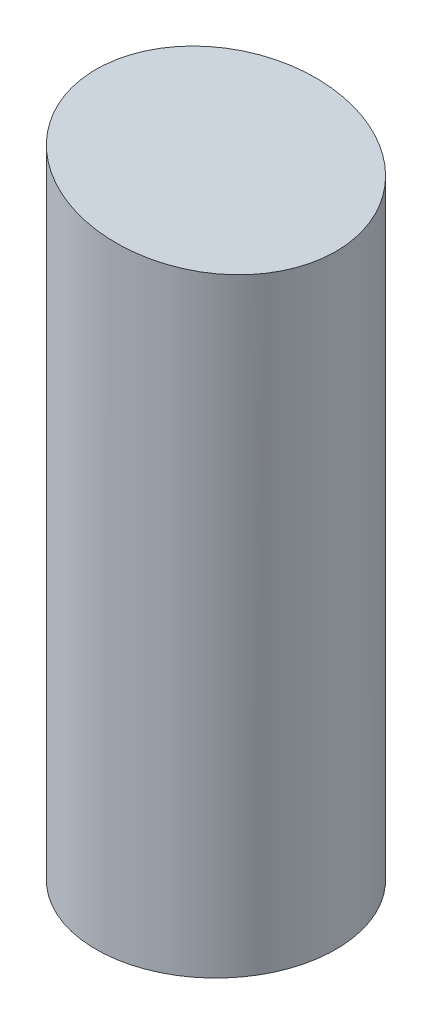
ISO-10303-21;
HEADER;
FILE_DESCRIPTION(('STEP AP214'),'2;1');
FILE_NAME('part.step','',(''),(''),'','','');
FILE_SCHEMA(('AUTOMOTIVE_DESIGN { 1 0 10303 214 1 1 1 1 }'));
ENDSEC;
DATA;
#1=APPLICATION_CONTEXT('core data for automotive mechanical design processes');
#2=APPLICATION_PROTOCOL_DEFINITION('international standard','automotive_design',2000,#1);
#3=PRODUCT_CONTEXT('',#1,'mechanical');
#4=PRODUCT('Part','Part','',(#3));
#5=PRODUCT_RELATED_PRODUCT_CATEGORY('part','',(#4));
#6=PRODUCT_DEFINITION_FORMATION('','',#4);
#7=PRODUCT_DEFINITION_CONTEXT('part definition',#1,'design');
#8=PRODUCT_DEFINITION('design','',#6,#7);
#9=PRODUCT_DEFINITION_SHAPE('','',#8);
#10=(LENGTH_UNIT() NAMED_UNIT(*) SI_UNIT(.MILLI.,.METRE.));
#11=(NAMED_UNIT(*) PLANE_ANGLE_UNIT() SI_UNIT($,.RADIAN.));
#12=(NAMED_UNIT(*) SI_UNIT($,.STERADIAN.) SOLID_ANGLE_UNIT());
#13=UNCERTAINTY_MEASURE_WITH_UNIT(LENGTH_MEASURE(1.E-05),#10,'distance_accuracy_value','');
#14=(GEOMETRIC_REPRESENTATION_CONTEXT(3) GLOBAL_UNCERTAINTY_ASSIGNED_CONTEXT((#13)) GLOBAL_UNIT_ASSIGNED_CONTEXT((#10,
#11,#12)) REPRESENTATION_CONTEXT('',''));
#15=CARTESIAN_POINT('',(0.,0.,0.));
#16=DIRECTION('',(0.,0.,1.));
#17=DIRECTION('',(1.,0.,0.));
#18=AXIS2_PLACEMENT_3D('',#15,#16,#17);
#19=CARTESIAN_POINT('',(0.,170.,0.));
#20=DIRECTION('',(0.,-1.,0.));
#21=DIRECTION('',(0.,0.,-1.));
#22=AXIS2_PLACEMENT_3D('',#19,#20,#21);
#23=CYLINDRICAL_SURFACE('',#22,31.75);
#24=CARTESIAN_POINT('',(0.,165.,0.));
#25=DIRECTION('',(-0.155563141844365,-0.987825950711718,0.));
#26=DIRECTION('',(0.987825950711718,-0.155563141844365,0.));
#27=AXIS2_PLACEMENT_3D('',#24,#25,#26);
#28=ELLIPSE('',#27,32.1412896443189,31.75);
#29=CARTESIAN_POINT('',(31.75,160.,0.));
#30=VERTEX_POINT('',#29);
#31=EDGE_CURVE('E114',#30,#30,#28,.T.);
#32=ORIENTED_EDGE('',*,*,#31,.T.);
#33=EDGE_LOOP('',(#32));
#34=FACE_BOUND('',#33,.T.);
#35=CARTESIAN_POINT('',(0.,8.00000000000001,0.));
#36=DIRECTION('',(0.,1.,0.));
#37=DIRECTION('',(0.,0.,1.));
#38=AXIS2_PLACEMENT_3D('',#35,#36,#37);
#39=CIRCLE('',#38,31.75);
#40=CARTESIAN_POINT('',(-31.75,8.00000000000001,0.));
#41=VERTEX_POINT('',#40);
#42=CARTESIAN_POINT('',(-31.6869452614164,8.00000000000001,2.));
#43=VERTEX_POINT('',#42);
#44=EDGE_CURVE('E40',#41,#43,#39,.T.);
#45=ORIENTED_EDGE('',*,*,#44,.T.);
#46=DIRECTION('',(0.,-1.,0.));
#47=VECTOR('',#46,1.);
#48=CARTESIAN_POINT('',(-31.6869452614164,170.,2.));
#49=LINE('',#48,#47);
#50=CARTESIAN_POINT('',(-31.6869452614164,0.,2.));
#51=VERTEX_POINT('',#50);
#52=EDGE_CURVE('E112',#43,#51,#49,.T.);
#53=ORIENTED_EDGE('',*,*,#52,.T.);
#54=CARTESIAN_POINT('',(0.,0.,0.));
#55=DIRECTION('',(0.,1.,0.));
#56=DIRECTION('',(0.,0.,1.));
#57=AXIS2_PLACEMENT_3D('',#54,#55,#56);
#58=CIRCLE('',#57,31.75);
#59=CARTESIAN_POINT('',(-31.6869452614164,0.,-2.));
#60=VERTEX_POINT('',#59);
#61=EDGE_CURVE('E116',#51,#60,#58,.T.);
#62=ORIENTED_EDGE('',*,*,#61,.T.);
#63=DIRECTION('',(0.,-1.,0.));
#64=VECTOR('',#63,1.);
#65=CARTESIAN_POINT('',(-31.6869452614164,170.,-2.));
#66=LINE('',#65,#64);
#67=CARTESIAN_POINT('',(-31.6869452614164,8.00000000000001,-2.));
#68=VERTEX_POINT('',#67);
#69=EDGE_CURVE('E50',#60,#68,#66,.F.);
#70=ORIENTED_EDGE('',*,*,#69,.T.);
#71=EDGE_CURVE('E11',#68,#41,#39,.T.);
#72=ORIENTED_EDGE('',*,*,#71,.T.);
#73=EDGE_LOOP('',(#45,#53,#62,#70,#72));
#74=FACE_BOUND('',#73,.T.);
#75=ADVANCED_FACE('F37',(#34,#74),#23,.T.);
#76=CARTESIAN_POINT('',(0.,0.,0.));
#77=DIRECTION('',(0.,1.,0.));
#78=DIRECTION('',(0.,0.,1.));
#79=AXIS2_PLACEMENT_3D('',#76,#77,#78);
#80=PLANE('',#79);
#81=ORIENTED_EDGE('',*,*,#61,.F.);
#82=DIRECTION('',(-1.,0.,0.));
#83=VECTOR('',#82,1.);
#84=CARTESIAN_POINT('',(-31.75,0.,2.));
#85=LINE('',#84,#83);
#86=CARTESIAN_POINT('',(-31.75,0.,2.));
#87=VERTEX_POINT('',#86);
#88=EDGE_CURVE('E105',#51,#87,#85,.T.);
#89=ORIENTED_EDGE('',*,*,#88,.T.);
#90=DIRECTION('',(0.,0.,-1.));
#91=VECTOR('',#90,1.);
#92=CARTESIAN_POINT('',(-31.75,0.,0.));
#93=LINE('',#92,#91);
#94=CARTESIAN_POINT('',(-31.75,0.,-2.));
#95=VERTEX_POINT('',#94);
#96=EDGE_CURVE('E89',#87,#95,#93,.T.);
#97=ORIENTED_EDGE('',*,*,#96,.T.);
#98=DIRECTION('',(1.,0.,0.));
#99=VECTOR('',#98,1.);
#100=CARTESIAN_POINT('',(-28.75,0.,-2.));
#101=LINE('',#100,#99);
#102=EDGE_CURVE('E96',#95,#60,#101,.T.);
#103=ORIENTED_EDGE('',*,*,#102,.T.);
#104=EDGE_LOOP('',(#81,#89,#97,#103));
#105=FACE_BOUND('',#104,.T.);
#106=ADVANCED_FACE('F119',(#105),#80,.F.);
#107=CARTESIAN_POINT('',(-31.75,170.,-90.));
#108=DIRECTION('',(-0.155563141844365,-0.987825950711718,0.));
#109=DIRECTION('',(0.987825950711718,-0.155563141844365,0.));
#110=AXIS2_PLACEMENT_3D('',#107,#108,#109);
#111=PLANE('',#110);
#112=ORIENTED_EDGE('',*,*,#31,.F.);
#113=EDGE_LOOP('',(#112));
#114=FACE_BOUND('',#113,.T.);
#115=ADVANCED_FACE('F133',(#114),#111,.F.);
#116=CARTESIAN_POINT('',(0.,8.,0.));
#117=DIRECTION('',(0.,1.,0.));
#118=DIRECTION('',(0.,0.,1.));
#119=AXIS2_PLACEMENT_3D('',#116,#117,#118);
#120=PLANE('',#119);
#121=ORIENTED_EDGE('',*,*,#71,.F.);
#122=DIRECTION('',(1.,0.,0.));
#123=VECTOR('',#122,1.);
#124=CARTESIAN_POINT('',(-28.75,8.,-2.));
#125=LINE('',#124,#123);
#126=CARTESIAN_POINT('',(-31.75,8.,-2.));
#127=VERTEX_POINT('',#126);
#128=EDGE_CURVE('E94',#127,#68,#125,.T.);
#129=ORIENTED_EDGE('',*,*,#128,.F.);
#130=DIRECTION('',(0.,0.,-1.));
#131=VECTOR('',#130,1.);
#132=CARTESIAN_POINT('',(-31.75,8.,-2.));
#133=LINE('',#132,#131);
#134=EDGE_CURVE('E79',#41,#127,#133,.T.);
#135=ORIENTED_EDGE('',*,*,#134,.F.);
#136=EDGE_LOOP('',(#121,#129,#135));
#137=FACE_BOUND('',#136,.T.);
#138=ADVANCED_FACE('F100',(#137),#120,.T.);
#139=CARTESIAN_POINT('',(-31.75,8.,0.));
#140=DIRECTION('',(-1.,0.,0.));
#141=DIRECTION('',(0.,0.,1.));
#142=AXIS2_PLACEMENT_3D('',#139,#140,#141);
#143=PLANE('',#142);
#144=ORIENTED_EDGE('',*,*,#96,.F.);
#145=DIRECTION('',(0.,-1.,0.));
#146=VECTOR('',#145,1.);
#147=CARTESIAN_POINT('',(-31.75,8.,2.));
#148=LINE('',#147,#146);
#149=CARTESIAN_POINT('',(-31.75,8.,2.));
#150=VERTEX_POINT('',#149);
#151=EDGE_CURVE('E97',#150,#87,#148,.T.);
#152=ORIENTED_EDGE('',*,*,#151,.F.);
#153=EDGE_CURVE('E86',#150,#41,#133,.T.);
#154=ORIENTED_EDGE('',*,*,#153,.T.);
#155=ORIENTED_EDGE('',*,*,#134,.T.);
#156=DIRECTION('',(0.,-1.,0.));
#157=VECTOR('',#156,1.);
#158=CARTESIAN_POINT('',(-31.75,8.,-2.));
#159=LINE('',#158,#157);
#160=EDGE_CURVE('E82',#127,#95,#159,.T.);
#161=ORIENTED_EDGE('',*,*,#160,.T.);
#162=EDGE_LOOP('',(#144,#152,#154,#155,#161));
#163=FACE_BOUND('',#162,.T.);
#164=ADVANCED_FACE('F81',(#163),#143,.T.);
#165=CARTESIAN_POINT('',(-31.75,8.,2.));
#166=DIRECTION('',(0.,0.,1.));
#167=DIRECTION('',(1.,0.,0.));
#168=AXIS2_PLACEMENT_3D('',#165,#166,#167);
#169=PLANE('',#168);
#170=ORIENTED_EDGE('',*,*,#52,.F.);
#171=DIRECTION('',(-1.,0.,0.));
#172=VECTOR('',#171,1.);
#173=CARTESIAN_POINT('',(-31.75,8.,2.));
#174=LINE('',#173,#172);
#175=EDGE_CURVE('E98',#43,#150,#174,.T.);
#176=ORIENTED_EDGE('',*,*,#175,.T.);
#177=ORIENTED_EDGE('',*,*,#151,.T.);
#178=ORIENTED_EDGE('',*,*,#88,.F.);
#179=EDGE_LOOP('',(#170,#176,#177,#178));
#180=FACE_BOUND('',#179,.T.);
#181=ADVANCED_FACE('F121',(#180),#169,.T.);
#182=CARTESIAN_POINT('',(-28.75,8.,-2.));
#183=DIRECTION('',(0.,0.,-1.));
#184=DIRECTION('',(-1.,0.,0.));
#185=AXIS2_PLACEMENT_3D('',#182,#183,#184);
#186=PLANE('',#185);
#187=ORIENTED_EDGE('',*,*,#69,.F.);
#188=ORIENTED_EDGE('',*,*,#102,.F.);
#189=ORIENTED_EDGE('',*,*,#160,.F.);
#190=ORIENTED_EDGE('',*,*,#128,.T.);
#191=EDGE_LOOP('',(#187,#188,#189,#190));
#192=FACE_BOUND('',#191,.T.);
#193=ADVANCED_FACE('F93',(#192),#186,.T.);
#194=ORIENTED_EDGE('',*,*,#44,.F.);
#195=ORIENTED_EDGE('',*,*,#153,.F.);
#196=ORIENTED_EDGE('',*,*,#175,.F.);
#197=EDGE_LOOP('',(#194,#195,#196));
#198=FACE_BOUND('',#197,.T.);
#199=ADVANCED_FACE('F124',(#198),#120,.T.);
#200=CLOSED_SHELL('',(#75,#106,#115,#138,#164,#181,#193,#199));
#201=MANIFOLD_SOLID_BREP('B2',#200);
#202=ADVANCED_BREP_SHAPE_REPRESENTATION('',(#18,#201),#14);
#203=SHAPE_DEFINITION_REPRESENTATION(#9,#202);
ENDSEC;
END-ISO-10303-21;
